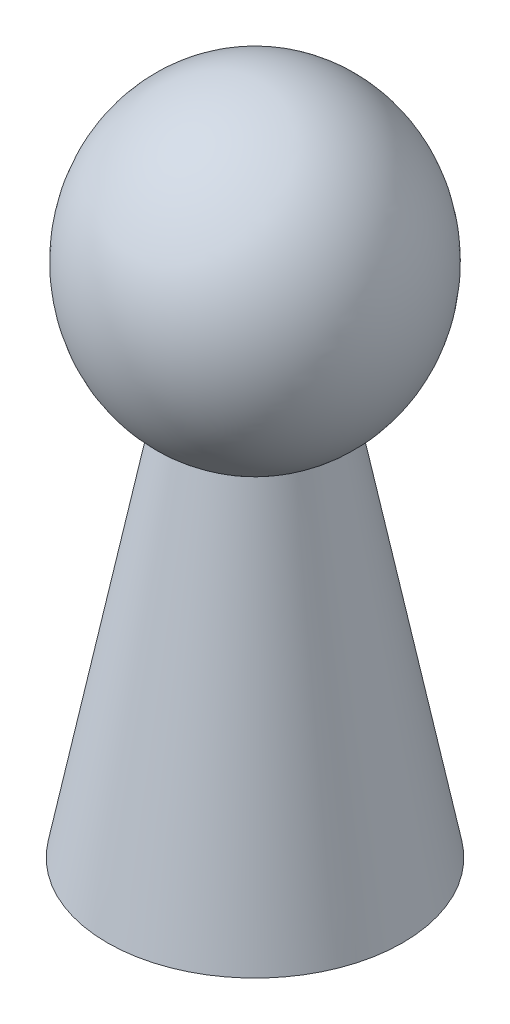
ISO-10303-21;
HEADER;
FILE_DESCRIPTION(('STEP AP214'),'2;1');
FILE_NAME('part.step','',(''),(''),'','','');
FILE_SCHEMA(('AUTOMOTIVE_DESIGN { 1 0 10303 214 1 1 1 1 }'));
ENDSEC;
DATA;
#1=APPLICATION_CONTEXT('core data for automotive mechanical design processes');
#2=APPLICATION_PROTOCOL_DEFINITION('international standard','automotive_design',2000,#1);
#3=PRODUCT_CONTEXT('',#1,'mechanical');
#4=PRODUCT('Part','Part','',(#3));
#5=PRODUCT_RELATED_PRODUCT_CATEGORY('part','',(#4));
#6=PRODUCT_DEFINITION_FORMATION('','',#4);
#7=PRODUCT_DEFINITION_CONTEXT('part definition',#1,'design');
#8=PRODUCT_DEFINITION('design','',#6,#7);
#9=PRODUCT_DEFINITION_SHAPE('','',#8);
#10=(LENGTH_UNIT() NAMED_UNIT(*) SI_UNIT(.MILLI.,.METRE.));
#11=(NAMED_UNIT(*) PLANE_ANGLE_UNIT() SI_UNIT($,.RADIAN.));
#12=(NAMED_UNIT(*) SI_UNIT($,.STERADIAN.) SOLID_ANGLE_UNIT());
#13=UNCERTAINTY_MEASURE_WITH_UNIT(LENGTH_MEASURE(1.E-05),#10,'distance_accuracy_value','');
#14=(GEOMETRIC_REPRESENTATION_CONTEXT(3) GLOBAL_UNCERTAINTY_ASSIGNED_CONTEXT((#13)) GLOBAL_UNIT_ASSIGNED_CONTEXT((#10,
#11,#12)) REPRESENTATION_CONTEXT('',''));
#15=CARTESIAN_POINT('',(0.,0.,0.));
#16=DIRECTION('',(0.,0.,1.));
#17=DIRECTION('',(1.,0.,0.));
#18=AXIS2_PLACEMENT_3D('',#15,#16,#17);
#19=CARTESIAN_POINT('',(0.,0.,0.));
#20=DIRECTION('',(0.,1.,0.));
#21=DIRECTION('',(0.,0.,1.));
#22=AXIS2_PLACEMENT_3D('',#19,#20,#21);
#23=PLANE('',#22);
#24=CARTESIAN_POINT('',(0.,0.,0.));
#25=DIRECTION('',(0.,1.,0.));
#26=DIRECTION('',(0.,0.,1.));
#27=AXIS2_PLACEMENT_3D('',#24,#25,#26);
#28=CIRCLE('',#27,8.9);
#29=CARTESIAN_POINT('',(0.,0.,8.9));
#30=VERTEX_POINT('',#29);
#31=EDGE_CURVE('E11',#30,#30,#28,.T.);
#32=ORIENTED_EDGE('',*,*,#31,.F.);
#33=EDGE_LOOP('',(#32));
#34=FACE_BOUND('',#33,.T.);
#35=ADVANCED_FACE('F33',(#34),#23,.F.);
#36=CARTESIAN_POINT('',(0.,0.,0.));
#37=DIRECTION('',(0.,-1.,0.));
#38=DIRECTION('',(0.,0.,-1.));
#39=AXIS2_PLACEMENT_3D('',#36,#37,#38);
#40=CONICAL_SURFACE('',#39,8.9,0.193211483847806);
#41=CARTESIAN_POINT('',(0.,23.,0.));
#42=DIRECTION('',(0.,1.,0.));
#43=DIRECTION('',(0.,0.,1.));
#44=AXIS2_PLACEMENT_3D('',#41,#42,#43);
#45=CIRCLE('',#44,4.4);
#46=CARTESIAN_POINT('',(0.,23.,4.4));
#47=VERTEX_POINT('',#46);
#48=EDGE_CURVE('E39',#47,#47,#45,.T.);
#49=ORIENTED_EDGE('',*,*,#48,.F.);
#50=EDGE_LOOP('',(#49));
#51=FACE_BOUND('',#50,.T.);
#52=ORIENTED_EDGE('',*,*,#31,.T.);
#53=EDGE_LOOP('',(#52));
#54=FACE_BOUND('',#53,.T.);
#55=ADVANCED_FACE('F45',(#51,#54),#40,.T.);
#56=CARTESIAN_POINT('',(0.,31.1134488539413,0.));
#57=DIRECTION('',(0.,0.,1.));
#58=DIRECTION('',(0.,-1.,0.));
#59=AXIS2_PLACEMENT_3D('',#56,#57,#58);
#60=ELLIPSE('',#59,9.38655114605874,8.75);
#61=TRIMMED_CURVE('',#60,(PARAMETER_VALUE(0.)),(PARAMETER_VALUE(3.14159265358979)),.T.,.PARAMETER.);
#62=CARTESIAN_POINT('',(0.,6.84252986519091,0.));
#63=DIRECTION('',(0.,1.,0.));
#64=AXIS1_PLACEMENT('',#62,#63);
#65=SURFACE_OF_REVOLUTION('',#61,#64);
#66=CARTESIAN_POINT('',(0.,40.5,0.));
#67=VERTEX_POINT('',#66);
#68=VERTEX_LOOP('',#67);
#69=FACE_BOUND('',#68,.T.);
#70=ORIENTED_EDGE('',*,*,#48,.T.);
#71=EDGE_LOOP('',(#70));
#72=FACE_BOUND('',#71,.T.);
#73=ADVANCED_FACE('F42',(#69,#72),#65,.T.);
#74=CLOSED_SHELL('',(#35,#55,#73));
#75=MANIFOLD_SOLID_BREP('B2',#74);
#76=ADVANCED_BREP_SHAPE_REPRESENTATION('',(#18,#75),#14);
#77=SHAPE_DEFINITION_REPRESENTATION(#9,#76);
ENDSEC;
END-ISO-10303-21;
